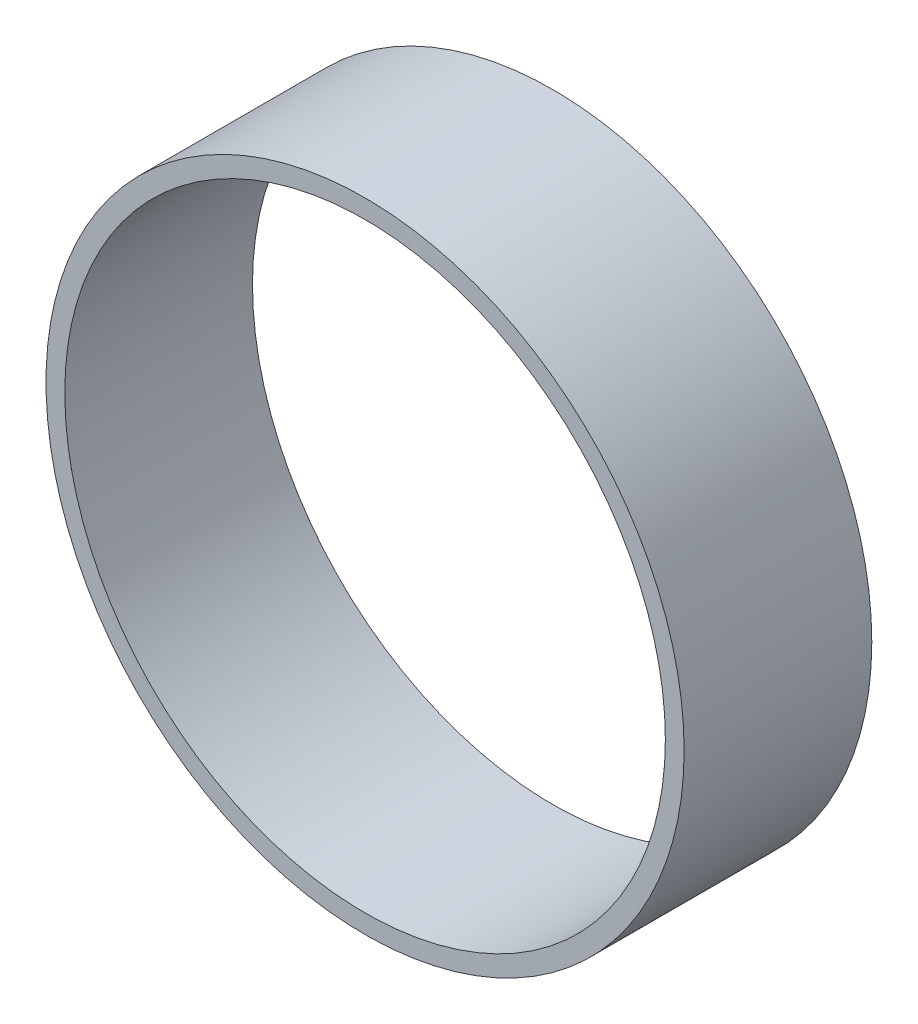
ISO-10303-21;
HEADER;
FILE_DESCRIPTION(('STEP AP214'),'2;1');
FILE_NAME('part.step','',(''),(''),'','','');
FILE_SCHEMA(('AUTOMOTIVE_DESIGN { 1 0 10303 214 1 1 1 1 }'));
ENDSEC;
DATA;
#1=APPLICATION_CONTEXT('core data for automotive mechanical design processes');
#2=APPLICATION_PROTOCOL_DEFINITION('international standard','automotive_design',2000,#1);
#3=PRODUCT_CONTEXT('',#1,'mechanical');
#4=PRODUCT('Part','Part','',(#3));
#5=PRODUCT_RELATED_PRODUCT_CATEGORY('part','',(#4));
#6=PRODUCT_DEFINITION_FORMATION('','',#4);
#7=PRODUCT_DEFINITION_CONTEXT('part definition',#1,'design');
#8=PRODUCT_DEFINITION('design','',#6,#7);
#9=PRODUCT_DEFINITION_SHAPE('','',#8);
#10=(LENGTH_UNIT() NAMED_UNIT(*) SI_UNIT(.MILLI.,.METRE.));
#11=(NAMED_UNIT(*) PLANE_ANGLE_UNIT() SI_UNIT($,.RADIAN.));
#12=(NAMED_UNIT(*) SI_UNIT($,.STERADIAN.) SOLID_ANGLE_UNIT());
#13=UNCERTAINTY_MEASURE_WITH_UNIT(LENGTH_MEASURE(1.E-05),#10,'distance_accuracy_value','');
#14=(GEOMETRIC_REPRESENTATION_CONTEXT(3) GLOBAL_UNCERTAINTY_ASSIGNED_CONTEXT((#13)) GLOBAL_UNIT_ASSIGNED_CONTEXT((#10,
#11,#12)) REPRESENTATION_CONTEXT('',''));
#15=CARTESIAN_POINT('',(0.,0.,0.));
#16=DIRECTION('',(0.,0.,1.));
#17=DIRECTION('',(1.,0.,0.));
#18=AXIS2_PLACEMENT_3D('',#15,#16,#17);
#19=CARTESIAN_POINT('',(0.,0.,5.));
#20=DIRECTION('',(0.,0.,1.));
#21=DIRECTION('',(1.,0.,0.));
#22=AXIS2_PLACEMENT_3D('',#19,#20,#21);
#23=PLANE('',#22);
#24=CARTESIAN_POINT('',(0.,0.,5.));
#25=DIRECTION('',(0.,0.,1.));
#26=DIRECTION('',(1.,0.,0.));
#27=AXIS2_PLACEMENT_3D('',#24,#25,#26);
#28=CIRCLE('',#27,8.5);
#29=CARTESIAN_POINT('',(8.5,0.,5.));
#30=VERTEX_POINT('',#29);
#31=EDGE_CURVE('E10',#30,#30,#28,.T.);
#32=ORIENTED_EDGE('',*,*,#31,.T.);
#33=EDGE_LOOP('',(#32));
#34=FACE_BOUND('',#33,.T.);
#35=CARTESIAN_POINT('',(0.,0.,5.));
#36=DIRECTION('',(0.,0.,1.));
#37=DIRECTION('',(1.,0.,0.));
#38=AXIS2_PLACEMENT_3D('',#35,#36,#37);
#39=CIRCLE('',#38,8.);
#40=CARTESIAN_POINT('',(8.,0.,5.));
#41=VERTEX_POINT('',#40);
#42=EDGE_CURVE('E50',#41,#41,#39,.T.);
#43=ORIENTED_EDGE('',*,*,#42,.F.);
#44=EDGE_LOOP('',(#43));
#45=FACE_BOUND('',#44,.T.);
#46=ADVANCED_FACE('F39',(#34,#45),#23,.T.);
#47=CARTESIAN_POINT('',(0.,0.,0.));
#48=DIRECTION('',(0.,0.,1.));
#49=DIRECTION('',(1.,0.,0.));
#50=AXIS2_PLACEMENT_3D('',#47,#48,#49);
#51=PLANE('',#50);
#52=CARTESIAN_POINT('',(0.,0.,0.));
#53=DIRECTION('',(0.,0.,1.));
#54=DIRECTION('',(1.,0.,0.));
#55=AXIS2_PLACEMENT_3D('',#52,#53,#54);
#56=CIRCLE('',#55,8.5);
#57=CARTESIAN_POINT('',(8.5,0.,0.));
#58=VERTEX_POINT('',#57);
#59=EDGE_CURVE('E43',#58,#58,#56,.T.);
#60=ORIENTED_EDGE('',*,*,#59,.F.);
#61=EDGE_LOOP('',(#60));
#62=FACE_BOUND('',#61,.T.);
#63=CARTESIAN_POINT('',(0.,0.,0.));
#64=DIRECTION('',(0.,0.,1.));
#65=DIRECTION('',(1.,0.,0.));
#66=AXIS2_PLACEMENT_3D('',#63,#64,#65);
#67=CIRCLE('',#66,8.);
#68=CARTESIAN_POINT('',(8.,0.,0.));
#69=VERTEX_POINT('',#68);
#70=EDGE_CURVE('E52',#69,#69,#67,.T.);
#71=ORIENTED_EDGE('',*,*,#70,.T.);
#72=EDGE_LOOP('',(#71));
#73=FACE_BOUND('',#72,.T.);
#74=ADVANCED_FACE('F62',(#62,#73),#51,.F.);
#75=CARTESIAN_POINT('',(0.,0.,5.));
#76=DIRECTION('',(0.,0.,-1.));
#77=DIRECTION('',(-1.,0.,0.));
#78=AXIS2_PLACEMENT_3D('',#75,#76,#77);
#79=CYLINDRICAL_SURFACE('',#78,8.5);
#80=ORIENTED_EDGE('',*,*,#31,.F.);
#81=EDGE_LOOP('',(#80));
#82=FACE_BOUND('',#81,.T.);
#83=ORIENTED_EDGE('',*,*,#59,.T.);
#84=EDGE_LOOP('',(#83));
#85=FACE_BOUND('',#84,.T.);
#86=ADVANCED_FACE('F41',(#82,#85),#79,.T.);
#87=CARTESIAN_POINT('',(0.,0.,5.));
#88=DIRECTION('',(0.,0.,-1.));
#89=DIRECTION('',(-1.,0.,0.));
#90=AXIS2_PLACEMENT_3D('',#87,#88,#89);
#91=CYLINDRICAL_SURFACE('',#90,8.);
#92=ORIENTED_EDGE('',*,*,#42,.T.);
#93=EDGE_LOOP('',(#92));
#94=FACE_BOUND('',#93,.T.);
#95=ORIENTED_EDGE('',*,*,#70,.F.);
#96=EDGE_LOOP('',(#95));
#97=FACE_BOUND('',#96,.T.);
#98=ADVANCED_FACE('F58',(#94,#97),#91,.F.);
#99=CLOSED_SHELL('',(#46,#74,#86,#98));
#100=MANIFOLD_SOLID_BREP('B2',#99);
#101=ADVANCED_BREP_SHAPE_REPRESENTATION('',(#18,#100),#14);
#102=SHAPE_DEFINITION_REPRESENTATION(#9,#101);
ENDSEC;
END-ISO-10303-21;
